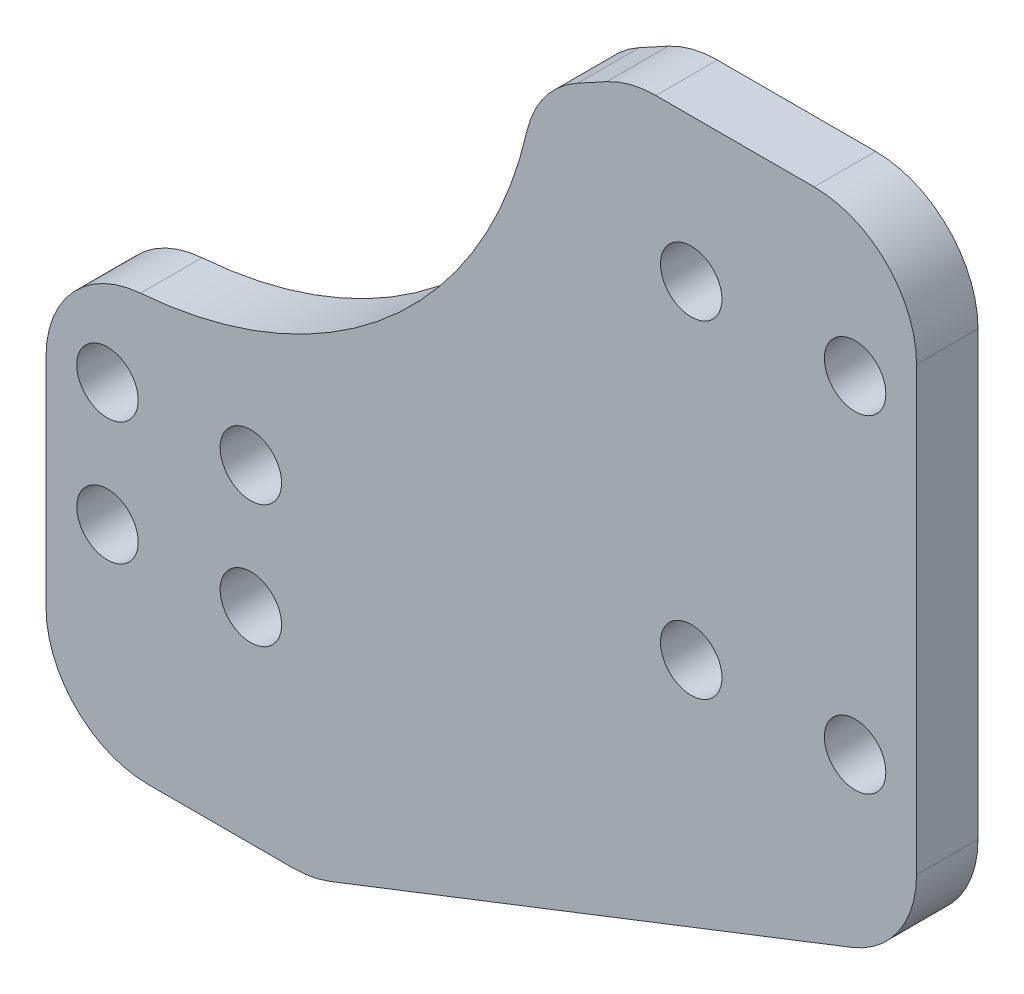
ISO-10303-21;
HEADER;
FILE_DESCRIPTION(('STEP AP214'),'2;1');
FILE_NAME('part.step','',(''),(''),'','','');
FILE_SCHEMA(('AUTOMOTIVE_DESIGN { 1 0 10303 214 1 1 1 1 }'));
ENDSEC;
DATA;
#1=APPLICATION_CONTEXT('core data for automotive mechanical design processes');
#2=APPLICATION_PROTOCOL_DEFINITION('international standard','automotive_design',2000,#1);
#3=PRODUCT_CONTEXT('',#1,'mechanical');
#4=PRODUCT('Part','Part','',(#3));
#5=PRODUCT_RELATED_PRODUCT_CATEGORY('part','',(#4));
#6=PRODUCT_DEFINITION_FORMATION('','',#4);
#7=PRODUCT_DEFINITION_CONTEXT('part definition',#1,'design');
#8=PRODUCT_DEFINITION('design','',#6,#7);
#9=PRODUCT_DEFINITION_SHAPE('','',#8);
#10=(LENGTH_UNIT() NAMED_UNIT(*) SI_UNIT(.MILLI.,.METRE.));
#11=(NAMED_UNIT(*) PLANE_ANGLE_UNIT() SI_UNIT($,.RADIAN.));
#12=(NAMED_UNIT(*) SI_UNIT($,.STERADIAN.) SOLID_ANGLE_UNIT());
#13=UNCERTAINTY_MEASURE_WITH_UNIT(LENGTH_MEASURE(1.E-05),#10,'distance_accuracy_value','');
#14=(GEOMETRIC_REPRESENTATION_CONTEXT(3) GLOBAL_UNCERTAINTY_ASSIGNED_CONTEXT((#13)) GLOBAL_UNIT_ASSIGNED_CONTEXT((#10,
#11,#12)) REPRESENTATION_CONTEXT('',''));
#15=CARTESIAN_POINT('',(0.,0.,0.));
#16=DIRECTION('',(0.,0.,1.));
#17=DIRECTION('',(1.,0.,0.));
#18=AXIS2_PLACEMENT_3D('',#15,#16,#17);
#19=CARTESIAN_POINT('',(0.,-13.,3.));
#20=DIRECTION('',(0.,1.,0.));
#21=DIRECTION('',(0.,0.,1.));
#22=AXIS2_PLACEMENT_3D('',#19,#20,#21);
#23=PLANE('',#22);
#24=DIRECTION('',(1.,0.,0.));
#25=VECTOR('',#24,1.);
#26=CARTESIAN_POINT('',(0.,-13.,3.));
#27=LINE('',#26,#25);
#28=CARTESIAN_POINT('',(-1.5,-13.,3.));
#29=VERTEX_POINT('',#28);
#30=CARTESIAN_POINT('',(5.55835501555251,-13.,3.));
#31=VERTEX_POINT('',#30);
#32=EDGE_CURVE('E168',#29,#31,#27,.T.);
#33=ORIENTED_EDGE('',*,*,#32,.F.);
#34=DIRECTION('',(0.,0.,-1.));
#35=VECTOR('',#34,1.);
#36=CARTESIAN_POINT('',(-1.5,-13.,0.));
#37=LINE('',#36,#35);
#38=CARTESIAN_POINT('',(-1.5,-13.,0.));
#39=VERTEX_POINT('',#38);
#40=EDGE_CURVE('E153',#29,#39,#37,.T.);
#41=ORIENTED_EDGE('',*,*,#40,.T.);
#42=DIRECTION('',(1.,0.,0.));
#43=VECTOR('',#42,1.);
#44=CARTESIAN_POINT('',(0.,-13.,0.));
#45=LINE('',#44,#43);
#46=CARTESIAN_POINT('',(5.55835501555251,-13.,0.));
#47=VERTEX_POINT('',#46);
#48=EDGE_CURVE('E165',#39,#47,#45,.T.);
#49=ORIENTED_EDGE('',*,*,#48,.T.);
#50=DIRECTION('',(0.,0.,-1.));
#51=VECTOR('',#50,1.);
#52=CARTESIAN_POINT('',(5.55835501555251,-13.,3.));
#53=LINE('',#52,#51);
#54=EDGE_CURVE('E170',#47,#31,#53,.F.);
#55=ORIENTED_EDGE('',*,*,#54,.T.);
#56=EDGE_LOOP('',(#33,#41,#49,#55));
#57=FACE_BOUND('',#56,.T.);
#58=ADVANCED_FACE('F46',(#57),#23,.F.);
#59=CARTESIAN_POINT('',(5.26495123835399,-13.4822970079377,3.));
#60=DIRECTION('',(0.363756352203741,-0.931494131077286,0.));
#61=DIRECTION('',(0.931494131077286,0.363756352203741,0.));
#62=AXIS2_PLACEMENT_3D('',#59,#60,#61);
#63=PLANE('',#62);
#64=DIRECTION('',(-0.931494131077286,-0.363756352203741,0.));
#65=VECTOR('',#64,1.);
#66=CARTESIAN_POINT('',(5.26495123835399,-13.4822970079377,3.));
#67=LINE('',#66,#65);
#68=CARTESIAN_POINT('',(32.8187817610187,-2.72229268179878,3.));
#69=VERTEX_POINT('',#68);
#70=CARTESIAN_POINT('',(7.37713677657121,-12.6574706553864,3.));
#71=VERTEX_POINT('',#70);
#72=EDGE_CURVE('E285',#69,#71,#67,.T.);
#73=ORIENTED_EDGE('',*,*,#72,.T.);
#74=DIRECTION('',(0.,0.,-1.));
#75=VECTOR('',#74,1.);
#76=CARTESIAN_POINT('',(7.37713677657121,-12.6574706553864,0.));
#77=LINE('',#76,#75);
#78=CARTESIAN_POINT('',(7.37713677657121,-12.6574706553864,0.));
#79=VERTEX_POINT('',#78);
#80=EDGE_CURVE('E236',#71,#79,#77,.T.);
#81=ORIENTED_EDGE('',*,*,#80,.T.);
#82=DIRECTION('',(-0.931494131077286,-0.363756352203741,0.));
#83=VECTOR('',#82,1.);
#84=CARTESIAN_POINT('',(5.26495123835399,-13.4822970079377,0.));
#85=LINE('',#84,#83);
#86=CARTESIAN_POINT('',(32.8187817610187,-2.72229268179878,0.));
#87=VERTEX_POINT('',#86);
#88=EDGE_CURVE('E175',#87,#79,#85,.T.);
#89=ORIENTED_EDGE('',*,*,#88,.F.);
#90=DIRECTION('',(0.,0.,-1.));
#91=VECTOR('',#90,1.);
#92=CARTESIAN_POINT('',(32.8187817610187,-2.72229268179877,3.));
#93=LINE('',#92,#91);
#94=EDGE_CURVE('E234',#87,#69,#93,.F.);
#95=ORIENTED_EDGE('',*,*,#94,.T.);
#96=EDGE_LOOP('',(#73,#81,#89,#95));
#97=FACE_BOUND('',#96,.T.);
#98=ADVANCED_FACE('F335',(#97),#63,.T.);
#99=CARTESIAN_POINT('',(36.,0.,3.));
#100=DIRECTION('',(1.,0.,0.));
#101=DIRECTION('',(0.,0.,-1.));
#102=AXIS2_PLACEMENT_3D('',#99,#100,#101);
#103=PLANE('',#102);
#104=DIRECTION('',(0.,-1.,0.));
#105=VECTOR('',#104,1.);
#106=CARTESIAN_POINT('',(36.,0.,3.));
#107=LINE('',#106,#105);
#108=CARTESIAN_POINT('',(36.,23.52,3.));
#109=VERTEX_POINT('',#108);
#110=CARTESIAN_POINT('',(36.,1.93517797358765,3.));
#111=VERTEX_POINT('',#110);
#112=EDGE_CURVE('E288',#109,#111,#107,.T.);
#113=ORIENTED_EDGE('',*,*,#112,.T.);
#114=DIRECTION('',(0.,0.,-1.));
#115=VECTOR('',#114,1.);
#116=CARTESIAN_POINT('',(36.,1.93517797358765,3.));
#117=LINE('',#116,#115);
#118=CARTESIAN_POINT('',(36.,1.93517797358765,0.));
#119=VERTEX_POINT('',#118);
#120=EDGE_CURVE('E241',#111,#119,#117,.T.);
#121=ORIENTED_EDGE('',*,*,#120,.T.);
#122=DIRECTION('',(0.,-1.,0.));
#123=VECTOR('',#122,1.);
#124=CARTESIAN_POINT('',(36.,0.,0.));
#125=LINE('',#124,#123);
#126=CARTESIAN_POINT('',(36.,23.52,0.));
#127=VERTEX_POINT('',#126);
#128=EDGE_CURVE('E178',#127,#119,#125,.T.);
#129=ORIENTED_EDGE('',*,*,#128,.F.);
#130=DIRECTION('',(0.,0.,-1.));
#131=VECTOR('',#130,1.);
#132=CARTESIAN_POINT('',(36.,23.52,3.));
#133=LINE('',#132,#131);
#134=EDGE_CURVE('E239',#127,#109,#133,.F.);
#135=ORIENTED_EDGE('',*,*,#134,.T.);
#136=EDGE_LOOP('',(#113,#121,#129,#135));
#137=FACE_BOUND('',#136,.T.);
#138=ADVANCED_FACE('F340',(#137),#103,.T.);
#139=CARTESIAN_POINT('',(0.,28.52,3.));
#140=DIRECTION('',(0.,1.,0.));
#141=DIRECTION('',(0.,0.,1.));
#142=AXIS2_PLACEMENT_3D('',#139,#140,#141);
#143=PLANE('',#142);
#144=DIRECTION('',(1.,0.,0.));
#145=VECTOR('',#144,1.);
#146=CARTESIAN_POINT('',(0.,28.52,3.));
#147=LINE('',#146,#145);
#148=CARTESIAN_POINT('',(23.2731367880601,28.52,3.));
#149=VERTEX_POINT('',#148);
#150=CARTESIAN_POINT('',(31.,28.52,3.));
#151=VERTEX_POINT('',#150);
#152=EDGE_CURVE('E291',#149,#151,#147,.T.);
#153=ORIENTED_EDGE('',*,*,#152,.T.);
#154=DIRECTION('',(0.,0.,-1.));
#155=VECTOR('',#154,1.);
#156=CARTESIAN_POINT('',(31.,28.52,3.));
#157=LINE('',#156,#155);
#158=CARTESIAN_POINT('',(31.,28.52,0.));
#159=VERTEX_POINT('',#158);
#160=EDGE_CURVE('E246',#151,#159,#157,.T.);
#161=ORIENTED_EDGE('',*,*,#160,.T.);
#162=DIRECTION('',(1.,0.,0.));
#163=VECTOR('',#162,1.);
#164=CARTESIAN_POINT('',(0.,28.52,0.));
#165=LINE('',#164,#163);
#166=CARTESIAN_POINT('',(23.2731367880601,28.52,0.));
#167=VERTEX_POINT('',#166);
#168=EDGE_CURVE('E187',#167,#159,#165,.T.);
#169=ORIENTED_EDGE('',*,*,#168,.F.);
#170=DIRECTION('',(0.,0.,-1.));
#171=VECTOR('',#170,1.);
#172=CARTESIAN_POINT('',(23.2731367880601,28.52,3.));
#173=LINE('',#172,#171);
#174=EDGE_CURVE('E244',#167,#149,#173,.F.);
#175=ORIENTED_EDGE('',*,*,#174,.T.);
#176=EDGE_LOOP('',(#153,#161,#169,#175));
#177=FACE_BOUND('',#176,.T.);
#178=ADVANCED_FACE('F346',(#177),#143,.T.);
#179=CARTESIAN_POINT('',(-6.94680076466091,12.7566895485075,3.));
#180=DIRECTION('',(0.478247495233169,-0.878225104004207,0.));
#181=DIRECTION('',(0.878225104004207,0.478247495233169,0.));
#182=AXIS2_PLACEMENT_3D('',#179,#180,#181);
#183=PLANE('',#182);
#184=DIRECTION('',(-0.878225104004207,-0.478247495233169,0.));
#185=VECTOR('',#184,1.);
#186=CARTESIAN_POINT('',(-6.94680076466091,12.7566895485075,3.));
#187=LINE('',#186,#185);
#188=CARTESIAN_POINT('',(20.8818993118943,27.9111255200211,3.));
#189=VERTEX_POINT('',#188);
#190=CARTESIAN_POINT('',(19.4593714707317,27.1364717623073,3.));
#191=VERTEX_POINT('',#190);
#192=EDGE_CURVE('E294',#189,#191,#187,.T.);
#193=ORIENTED_EDGE('',*,*,#192,.F.);
#194=DIRECTION('',(0.,0.,-1.));
#195=VECTOR('',#194,1.);
#196=CARTESIAN_POINT('',(20.8818993118943,27.9111255200211,0.));
#197=LINE('',#196,#195);
#198=CARTESIAN_POINT('',(20.8818993118943,27.9111255200211,0.));
#199=VERTEX_POINT('',#198);
#200=EDGE_CURVE('E251',#189,#199,#197,.T.);
#201=ORIENTED_EDGE('',*,*,#200,.T.);
#202=DIRECTION('',(-0.878225104004207,-0.478247495233169,0.));
#203=VECTOR('',#202,1.);
#204=CARTESIAN_POINT('',(-6.94680076466091,12.7566895485075,0.));
#205=LINE('',#204,#203);
#206=CARTESIAN_POINT('',(19.4593714707317,27.1364717623073,0.));
#207=VERTEX_POINT('',#206);
#208=EDGE_CURVE('E190',#199,#207,#205,.T.);
#209=ORIENTED_EDGE('',*,*,#208,.T.);
#210=DIRECTION('',(0.,0.,1.));
#211=VECTOR('',#210,1.);
#212=CARTESIAN_POINT('',(19.4593714707317,27.1364717623072,3.));
#213=LINE('',#212,#211);
#214=EDGE_CURVE('E249',#207,#191,#213,.T.);
#215=ORIENTED_EDGE('',*,*,#214,.T.);
#216=EDGE_LOOP('',(#193,#201,#209,#215));
#217=FACE_BOUND('',#216,.T.);
#218=ADVANCED_FACE('F350',(#217),#183,.F.);
#219=CARTESIAN_POINT('',(33.,5.52,3.));
#220=DIRECTION('',(0.,0.,-1.));
#221=DIRECTION('',(-1.,0.,0.));
#222=AXIS2_PLACEMENT_3D('',#219,#220,#221);
#223=CYLINDRICAL_SURFACE('',#222,1.5);
#224=CARTESIAN_POINT('',(33.,5.52,3.));
#225=DIRECTION('',(0.,0.,1.));
#226=DIRECTION('',(1.,0.,0.));
#227=AXIS2_PLACEMENT_3D('',#224,#225,#226);
#228=CIRCLE('',#227,1.5);
#229=CARTESIAN_POINT('',(34.5,5.52,3.));
#230=VERTEX_POINT('',#229);
#231=EDGE_CURVE('E304',#230,#230,#228,.T.);
#232=ORIENTED_EDGE('',*,*,#231,.T.);
#233=EDGE_LOOP('',(#232));
#234=FACE_BOUND('',#233,.T.);
#235=CARTESIAN_POINT('',(33.,5.52,0.));
#236=DIRECTION('',(0.,0.,1.));
#237=DIRECTION('',(1.,0.,0.));
#238=AXIS2_PLACEMENT_3D('',#235,#236,#237);
#239=CIRCLE('',#238,1.5);
#240=CARTESIAN_POINT('',(34.5,5.52,0.));
#241=VERTEX_POINT('',#240);
#242=EDGE_CURVE('E201',#241,#241,#239,.T.);
#243=ORIENTED_EDGE('',*,*,#242,.F.);
#244=EDGE_LOOP('',(#243));
#245=FACE_BOUND('',#244,.T.);
#246=ADVANCED_FACE('F354',(#234,#245),#223,.F.);
#247=CARTESIAN_POINT('',(25.,5.52,3.));
#248=DIRECTION('',(0.,0.,-1.));
#249=DIRECTION('',(-1.,0.,0.));
#250=AXIS2_PLACEMENT_3D('',#247,#248,#249);
#251=CYLINDRICAL_SURFACE('',#250,1.5);
#252=CARTESIAN_POINT('',(25.,5.52,3.));
#253=DIRECTION('',(0.,0.,1.));
#254=DIRECTION('',(1.,0.,0.));
#255=AXIS2_PLACEMENT_3D('',#252,#253,#254);
#256=CIRCLE('',#255,1.5);
#257=CARTESIAN_POINT('',(26.5,5.52,3.));
#258=VERTEX_POINT('',#257);
#259=EDGE_CURVE('E301',#258,#258,#256,.T.);
#260=ORIENTED_EDGE('',*,*,#259,.T.);
#261=EDGE_LOOP('',(#260));
#262=FACE_BOUND('',#261,.T.);
#263=CARTESIAN_POINT('',(25.,5.52,0.));
#264=DIRECTION('',(0.,0.,1.));
#265=DIRECTION('',(1.,0.,0.));
#266=AXIS2_PLACEMENT_3D('',#263,#264,#265);
#267=CIRCLE('',#266,1.5);
#268=CARTESIAN_POINT('',(26.5,5.52,0.));
#269=VERTEX_POINT('',#268);
#270=EDGE_CURVE('E198',#269,#269,#267,.T.);
#271=ORIENTED_EDGE('',*,*,#270,.F.);
#272=EDGE_LOOP('',(#271));
#273=FACE_BOUND('',#272,.T.);
#274=ADVANCED_FACE('F362',(#262,#273),#251,.F.);
#275=CARTESIAN_POINT('',(25.,21.52,3.));
#276=DIRECTION('',(0.,0.,-1.));
#277=DIRECTION('',(-1.,0.,0.));
#278=AXIS2_PLACEMENT_3D('',#275,#276,#277);
#279=CYLINDRICAL_SURFACE('',#278,1.5);
#280=CARTESIAN_POINT('',(25.,21.52,3.));
#281=DIRECTION('',(0.,0.,1.));
#282=DIRECTION('',(1.,0.,0.));
#283=AXIS2_PLACEMENT_3D('',#280,#281,#282);
#284=CIRCLE('',#283,1.5);
#285=CARTESIAN_POINT('',(26.5,21.52,3.));
#286=VERTEX_POINT('',#285);
#287=EDGE_CURVE('E298',#286,#286,#284,.T.);
#288=ORIENTED_EDGE('',*,*,#287,.T.);
#289=EDGE_LOOP('',(#288));
#290=FACE_BOUND('',#289,.T.);
#291=CARTESIAN_POINT('',(25.,21.52,0.));
#292=DIRECTION('',(0.,0.,1.));
#293=DIRECTION('',(1.,0.,0.));
#294=AXIS2_PLACEMENT_3D('',#291,#292,#293);
#295=CIRCLE('',#294,1.5);
#296=CARTESIAN_POINT('',(26.5,21.52,0.));
#297=VERTEX_POINT('',#296);
#298=EDGE_CURVE('E195',#297,#297,#295,.T.);
#299=ORIENTED_EDGE('',*,*,#298,.F.);
#300=EDGE_LOOP('',(#299));
#301=FACE_BOUND('',#300,.T.);
#302=ADVANCED_FACE('F358',(#290,#301),#279,.F.);
#303=CARTESIAN_POINT('',(-6.5,0.,3.));
#304=DIRECTION('',(-1.,0.,0.));
#305=DIRECTION('',(0.,0.,1.));
#306=AXIS2_PLACEMENT_3D('',#303,#304,#305);
#307=PLANE('',#306);
#308=DIRECTION('',(0.,1.,0.));
#309=VECTOR('',#308,1.);
#310=CARTESIAN_POINT('',(-6.5,0.,0.));
#311=LINE('',#310,#309);
#312=CARTESIAN_POINT('',(-6.5,-8.,0.));
#313=VERTEX_POINT('',#312);
#314=CARTESIAN_POINT('',(-6.5,2.59703720636856,0.));
#315=VERTEX_POINT('',#314);
#316=EDGE_CURVE('E193',#313,#315,#311,.T.);
#317=ORIENTED_EDGE('',*,*,#316,.F.);
#318=DIRECTION('',(0.,0.,-1.));
#319=VECTOR('',#318,1.);
#320=CARTESIAN_POINT('',(-6.5,-8.,3.));
#321=LINE('',#320,#319);
#322=CARTESIAN_POINT('',(-6.5,-8.,3.));
#323=VERTEX_POINT('',#322);
#324=EDGE_CURVE('E154',#313,#323,#321,.F.);
#325=ORIENTED_EDGE('',*,*,#324,.T.);
#326=DIRECTION('',(0.,1.,0.));
#327=VECTOR('',#326,1.);
#328=CARTESIAN_POINT('',(-6.5,0.,3.));
#329=LINE('',#328,#327);
#330=CARTESIAN_POINT('',(-6.5,2.59703720636856,3.));
#331=VERTEX_POINT('',#330);
#332=EDGE_CURVE('E296',#323,#331,#329,.T.);
#333=ORIENTED_EDGE('',*,*,#332,.T.);
#334=DIRECTION('',(0.,0.,-1.));
#335=VECTOR('',#334,1.);
#336=CARTESIAN_POINT('',(-6.5,2.59703720636856,0.));
#337=LINE('',#336,#335);
#338=EDGE_CURVE('E159',#331,#315,#337,.T.);
#339=ORIENTED_EDGE('',*,*,#338,.T.);
#340=EDGE_LOOP('',(#317,#325,#333,#339));
#341=FACE_BOUND('',#340,.T.);
#342=ADVANCED_FACE('F331',(#341),#307,.T.);
#343=CARTESIAN_POINT('',(3.5,3.,3.));
#344=DIRECTION('',(0.,0.,-1.));
#345=DIRECTION('',(-1.,0.,0.));
#346=AXIS2_PLACEMENT_3D('',#343,#344,#345);
#347=CYLINDRICAL_SURFACE('',#346,1.5);
#348=CARTESIAN_POINT('',(3.5,3.,3.));
#349=DIRECTION('',(0.,0.,1.));
#350=DIRECTION('',(1.,0.,0.));
#351=AXIS2_PLACEMENT_3D('',#348,#349,#350);
#352=CIRCLE('',#351,1.5);
#353=CARTESIAN_POINT('',(5.,3.,3.));
#354=VERTEX_POINT('',#353);
#355=EDGE_CURVE('E281',#354,#354,#352,.T.);
#356=ORIENTED_EDGE('',*,*,#355,.T.);
#357=EDGE_LOOP('',(#356));
#358=FACE_BOUND('',#357,.T.);
#359=CARTESIAN_POINT('',(3.5,3.,0.));
#360=DIRECTION('',(0.,0.,1.));
#361=DIRECTION('',(1.,0.,0.));
#362=AXIS2_PLACEMENT_3D('',#359,#360,#361);
#363=CIRCLE('',#362,1.5);
#364=CARTESIAN_POINT('',(5.,3.,0.));
#365=VERTEX_POINT('',#364);
#366=EDGE_CURVE('E176',#365,#365,#363,.T.);
#367=ORIENTED_EDGE('',*,*,#366,.F.);
#368=EDGE_LOOP('',(#367));
#369=FACE_BOUND('',#368,.T.);
#370=ADVANCED_FACE('F321',(#358,#369),#347,.F.);
#371=CARTESIAN_POINT('',(3.5,-3.,3.));
#372=DIRECTION('',(0.,0.,-1.));
#373=DIRECTION('',(-1.,0.,0.));
#374=AXIS2_PLACEMENT_3D('',#371,#372,#373);
#375=CYLINDRICAL_SURFACE('',#374,1.5);
#376=CARTESIAN_POINT('',(3.5,-3.,3.));
#377=DIRECTION('',(0.,0.,1.));
#378=DIRECTION('',(1.,0.,0.));
#379=AXIS2_PLACEMENT_3D('',#376,#377,#378);
#380=CIRCLE('',#379,1.5);
#381=CARTESIAN_POINT('',(5.,-3.,3.));
#382=VERTEX_POINT('',#381);
#383=EDGE_CURVE('E278',#382,#382,#380,.T.);
#384=ORIENTED_EDGE('',*,*,#383,.T.);
#385=EDGE_LOOP('',(#384));
#386=FACE_BOUND('',#385,.T.);
#387=CARTESIAN_POINT('',(3.5,-3.,0.));
#388=DIRECTION('',(0.,0.,1.));
#389=DIRECTION('',(1.,0.,0.));
#390=AXIS2_PLACEMENT_3D('',#387,#388,#389);
#391=CIRCLE('',#390,1.5);
#392=CARTESIAN_POINT('',(5.,-3.,0.));
#393=VERTEX_POINT('',#392);
#394=EDGE_CURVE('E181',#393,#393,#391,.T.);
#395=ORIENTED_EDGE('',*,*,#394,.F.);
#396=EDGE_LOOP('',(#395));
#397=FACE_BOUND('',#396,.T.);
#398=ADVANCED_FACE('F318',(#386,#397),#375,.F.);
#399=CARTESIAN_POINT('',(-3.5,-3.,3.));
#400=DIRECTION('',(0.,0.,-1.));
#401=DIRECTION('',(-1.,0.,0.));
#402=AXIS2_PLACEMENT_3D('',#399,#400,#401);
#403=CYLINDRICAL_SURFACE('',#402,1.5);
#404=CARTESIAN_POINT('',(-3.5,-3.,3.));
#405=DIRECTION('',(0.,0.,1.));
#406=DIRECTION('',(1.,0.,0.));
#407=AXIS2_PLACEMENT_3D('',#404,#405,#406);
#408=CIRCLE('',#407,1.5);
#409=CARTESIAN_POINT('',(-2.,-3.,3.));
#410=VERTEX_POINT('',#409);
#411=EDGE_CURVE('E275',#410,#410,#408,.T.);
#412=ORIENTED_EDGE('',*,*,#411,.T.);
#413=EDGE_LOOP('',(#412));
#414=FACE_BOUND('',#413,.T.);
#415=CARTESIAN_POINT('',(-3.5,-3.,0.));
#416=DIRECTION('',(0.,0.,1.));
#417=DIRECTION('',(1.,0.,0.));
#418=AXIS2_PLACEMENT_3D('',#415,#416,#417);
#419=CIRCLE('',#418,1.5);
#420=CARTESIAN_POINT('',(-2.,-3.,0.));
#421=VERTEX_POINT('',#420);
#422=EDGE_CURVE('E311',#421,#421,#419,.T.);
#423=ORIENTED_EDGE('',*,*,#422,.F.);
#424=EDGE_LOOP('',(#423));
#425=FACE_BOUND('',#424,.T.);
#426=ADVANCED_FACE('F320',(#414,#425),#403,.F.);
#427=CARTESIAN_POINT('',(-3.5,3.,3.));
#428=DIRECTION('',(0.,0.,-1.));
#429=DIRECTION('',(-1.,0.,0.));
#430=AXIS2_PLACEMENT_3D('',#427,#428,#429);
#431=CYLINDRICAL_SURFACE('',#430,1.5);
#432=CARTESIAN_POINT('',(-3.5,3.,3.));
#433=DIRECTION('',(0.,0.,1.));
#434=DIRECTION('',(1.,0.,0.));
#435=AXIS2_PLACEMENT_3D('',#432,#433,#434);
#436=CIRCLE('',#435,1.5);
#437=CARTESIAN_POINT('',(-2.,3.,3.));
#438=VERTEX_POINT('',#437);
#439=EDGE_CURVE('E207',#438,#438,#436,.T.);
#440=ORIENTED_EDGE('',*,*,#439,.T.);
#441=EDGE_LOOP('',(#440));
#442=FACE_BOUND('',#441,.T.);
#443=CARTESIAN_POINT('',(-3.5,3.,0.));
#444=DIRECTION('',(0.,0.,1.));
#445=DIRECTION('',(1.,0.,0.));
#446=AXIS2_PLACEMENT_3D('',#443,#444,#445);
#447=CIRCLE('',#446,1.5);
#448=CARTESIAN_POINT('',(-2.,3.,0.));
#449=VERTEX_POINT('',#448);
#450=EDGE_CURVE('E270',#449,#449,#447,.T.);
#451=ORIENTED_EDGE('',*,*,#450,.F.);
#452=EDGE_LOOP('',(#451));
#453=FACE_BOUND('',#452,.T.);
#454=ADVANCED_FACE('F328',(#442,#453),#431,.F.);
#455=CARTESIAN_POINT('',(33.,21.52,3.));
#456=DIRECTION('',(0.,0.,-1.));
#457=DIRECTION('',(-1.,0.,0.));
#458=AXIS2_PLACEMENT_3D('',#455,#456,#457);
#459=CYLINDRICAL_SURFACE('',#458,1.5);
#460=CARTESIAN_POINT('',(33.,21.52,3.));
#461=DIRECTION('',(0.,0.,1.));
#462=DIRECTION('',(1.,0.,0.));
#463=AXIS2_PLACEMENT_3D('',#460,#461,#462);
#464=CIRCLE('',#463,1.5);
#465=CARTESIAN_POINT('',(34.5,21.52,3.));
#466=VERTEX_POINT('',#465);
#467=EDGE_CURVE('E208',#466,#466,#464,.T.);
#468=ORIENTED_EDGE('',*,*,#467,.T.);
#469=EDGE_LOOP('',(#468));
#470=FACE_BOUND('',#469,.T.);
#471=CARTESIAN_POINT('',(33.,21.52,0.));
#472=DIRECTION('',(0.,0.,1.));
#473=DIRECTION('',(1.,0.,0.));
#474=AXIS2_PLACEMENT_3D('',#471,#472,#473);
#475=CIRCLE('',#474,1.5);
#476=CARTESIAN_POINT('',(34.5,21.52,0.));
#477=VERTEX_POINT('',#476);
#478=EDGE_CURVE('E204',#477,#477,#475,.T.);
#479=ORIENTED_EDGE('',*,*,#478,.F.);
#480=EDGE_LOOP('',(#479));
#481=FACE_BOUND('',#480,.T.);
#482=ADVANCED_FACE('F370',(#470,#481),#459,.F.);
#483=CARTESIAN_POINT('',(0.,0.,3.));
#484=DIRECTION('',(0.,0.,1.));
#485=DIRECTION('',(1.,0.,0.));
#486=AXIS2_PLACEMENT_3D('',#483,#484,#485);
#487=PLANE('',#486);
#488=ORIENTED_EDGE('',*,*,#332,.F.);
#489=CARTESIAN_POINT('',(-1.5,-8.,3.));
#490=DIRECTION('',(0.,0.,1.));
#491=DIRECTION('',(1.,0.,0.));
#492=AXIS2_PLACEMENT_3D('',#489,#490,#491);
#493=CIRCLE('',#492,5.);
#494=EDGE_CURVE('E232',#323,#29,#493,.T.);
#495=ORIENTED_EDGE('',*,*,#494,.T.);
#496=ORIENTED_EDGE('',*,*,#32,.T.);
#497=CARTESIAN_POINT('',(5.55835501555251,-8.,3.));
#498=DIRECTION('',(0.,0.,1.));
#499=DIRECTION('',(1.,0.,0.));
#500=AXIS2_PLACEMENT_3D('',#497,#498,#499);
#501=CIRCLE('',#500,5.);
#502=EDGE_CURVE('E230',#31,#71,#501,.T.);
#503=ORIENTED_EDGE('',*,*,#502,.T.);
#504=ORIENTED_EDGE('',*,*,#72,.F.);
#505=CARTESIAN_POINT('',(31.,1.93517797358765,3.));
#506=DIRECTION('',(0.,0.,1.));
#507=DIRECTION('',(1.,0.,0.));
#508=AXIS2_PLACEMENT_3D('',#505,#506,#507);
#509=CIRCLE('',#508,5.);
#510=EDGE_CURVE('E228',#69,#111,#509,.T.);
#511=ORIENTED_EDGE('',*,*,#510,.T.);
#512=ORIENTED_EDGE('',*,*,#112,.F.);
#513=CARTESIAN_POINT('',(31.,23.52,3.));
#514=DIRECTION('',(0.,0.,1.));
#515=DIRECTION('',(1.,0.,0.));
#516=AXIS2_PLACEMENT_3D('',#513,#514,#515);
#517=CIRCLE('',#516,5.);
#518=EDGE_CURVE('E226',#109,#151,#517,.T.);
#519=ORIENTED_EDGE('',*,*,#518,.T.);
#520=ORIENTED_EDGE('',*,*,#152,.F.);
#521=CARTESIAN_POINT('',(23.2731367880601,23.52,3.));
#522=DIRECTION('',(0.,0.,1.));
#523=DIRECTION('',(1.,0.,0.));
#524=AXIS2_PLACEMENT_3D('',#521,#522,#523);
#525=CIRCLE('',#524,5.);
#526=EDGE_CURVE('E69',#149,#189,#525,.T.);
#527=ORIENTED_EDGE('',*,*,#526,.T.);
#528=ORIENTED_EDGE('',*,*,#192,.T.);
#529=CARTESIAN_POINT('',(21.8506089468975,22.7453462422862,3.));
#530=DIRECTION('',(0.,0.,1.));
#531=DIRECTION('',(1.,0.,0.));
#532=AXIS2_PLACEMENT_3D('',#529,#530,#531);
#533=CIRCLE('',#532,5.);
#534=CARTESIAN_POINT('',(16.9754918417249,23.8558565803081,3.));
#535=VERTEX_POINT('',#534);
#536=EDGE_CURVE('E61',#191,#535,#533,.T.);
#537=ORIENTED_EDGE('',*,*,#536,.T.);
#538=CARTESIAN_POINT('',(-3.5,28.52,3.));
#539=DIRECTION('',(0.,0.,1.));
#540=DIRECTION('',(1.,0.,0.));
#541=AXIS2_PLACEMENT_3D('',#538,#539,#540);
#542=CIRCLE('',#541,21.);
#543=CARTESIAN_POINT('',(-1.88461538461539,7.58222235898999,3.));
#544=VERTEX_POINT('',#543);
#545=EDGE_CURVE('E260',#544,#535,#542,.T.);
#546=ORIENTED_EDGE('',*,*,#545,.F.);
#547=CARTESIAN_POINT('',(-1.5,2.59703720636856,3.));
#548=DIRECTION('',(0.,0.,1.));
#549=DIRECTION('',(1.,0.,0.));
#550=AXIS2_PLACEMENT_3D('',#547,#548,#549);
#551=CIRCLE('',#550,5.);
#552=EDGE_CURVE('E222',#544,#331,#551,.T.);
#553=ORIENTED_EDGE('',*,*,#552,.T.);
#554=EDGE_LOOP('',(#488,#495,#496,#503,#504,#511,#512,#519,#520,#527,#528,#537,#546,#553));
#555=FACE_BOUND('',#554,.T.);
#556=ORIENTED_EDGE('',*,*,#439,.F.);
#557=EDGE_LOOP('',(#556));
#558=FACE_BOUND('',#557,.T.);
#559=ORIENTED_EDGE('',*,*,#411,.F.);
#560=EDGE_LOOP('',(#559));
#561=FACE_BOUND('',#560,.T.);
#562=ORIENTED_EDGE('',*,*,#383,.F.);
#563=EDGE_LOOP('',(#562));
#564=FACE_BOUND('',#563,.T.);
#565=ORIENTED_EDGE('',*,*,#355,.F.);
#566=EDGE_LOOP('',(#565));
#567=FACE_BOUND('',#566,.T.);
#568=ORIENTED_EDGE('',*,*,#287,.F.);
#569=EDGE_LOOP('',(#568));
#570=FACE_BOUND('',#569,.T.);
#571=ORIENTED_EDGE('',*,*,#259,.F.);
#572=EDGE_LOOP('',(#571));
#573=FACE_BOUND('',#572,.T.);
#574=ORIENTED_EDGE('',*,*,#231,.F.);
#575=EDGE_LOOP('',(#574));
#576=FACE_BOUND('',#575,.T.);
#577=ORIENTED_EDGE('',*,*,#467,.F.);
#578=EDGE_LOOP('',(#577));
#579=FACE_BOUND('',#578,.T.);
#580=ADVANCED_FACE('F266',(#555,#558,#561,#564,#567,#570,#573,#576,#579),#487,.T.);
#581=CARTESIAN_POINT('',(0.,0.,0.));
#582=DIRECTION('',(0.,0.,1.));
#583=DIRECTION('',(1.,0.,0.));
#584=AXIS2_PLACEMENT_3D('',#581,#582,#583);
#585=PLANE('',#584);
#586=ORIENTED_EDGE('',*,*,#450,.T.);
#587=EDGE_LOOP('',(#586));
#588=FACE_BOUND('',#587,.T.);
#589=ORIENTED_EDGE('',*,*,#422,.T.);
#590=EDGE_LOOP('',(#589));
#591=FACE_BOUND('',#590,.T.);
#592=ORIENTED_EDGE('',*,*,#394,.T.);
#593=EDGE_LOOP('',(#592));
#594=FACE_BOUND('',#593,.T.);
#595=ORIENTED_EDGE('',*,*,#366,.T.);
#596=EDGE_LOOP('',(#595));
#597=FACE_BOUND('',#596,.T.);
#598=ORIENTED_EDGE('',*,*,#48,.F.);
#599=CARTESIAN_POINT('',(-1.5,-8.,0.));
#600=DIRECTION('',(0.,0.,1.));
#601=DIRECTION('',(1.,0.,0.));
#602=AXIS2_PLACEMENT_3D('',#599,#600,#601);
#603=CIRCLE('',#602,5.);
#604=EDGE_CURVE('E149',#39,#313,#603,.F.);
#605=ORIENTED_EDGE('',*,*,#604,.T.);
#606=ORIENTED_EDGE('',*,*,#316,.T.);
#607=CARTESIAN_POINT('',(-1.5,2.59703720636856,0.));
#608=DIRECTION('',(0.,0.,1.));
#609=DIRECTION('',(1.,0.,0.));
#610=AXIS2_PLACEMENT_3D('',#607,#608,#609);
#611=CIRCLE('',#610,5.);
#612=CARTESIAN_POINT('',(-1.88461538461539,7.58222235898999,0.));
#613=VERTEX_POINT('',#612);
#614=EDGE_CURVE('E169',#315,#613,#611,.F.);
#615=ORIENTED_EDGE('',*,*,#614,.T.);
#616=CARTESIAN_POINT('',(-3.5,28.52,0.));
#617=DIRECTION('',(0.,0.,1.));
#618=DIRECTION('',(1.,0.,0.));
#619=AXIS2_PLACEMENT_3D('',#616,#617,#618);
#620=CIRCLE('',#619,21.);
#621=CARTESIAN_POINT('',(16.9754918417249,23.8558565803081,0.));
#622=VERTEX_POINT('',#621);
#623=EDGE_CURVE('E262',#613,#622,#620,.T.);
#624=ORIENTED_EDGE('',*,*,#623,.T.);
#625=CARTESIAN_POINT('',(21.8506089468975,22.7453462422862,0.));
#626=DIRECTION('',(0.,0.,1.));
#627=DIRECTION('',(1.,0.,0.));
#628=AXIS2_PLACEMENT_3D('',#625,#626,#627);
#629=CIRCLE('',#628,5.);
#630=EDGE_CURVE('E211',#622,#207,#629,.F.);
#631=ORIENTED_EDGE('',*,*,#630,.T.);
#632=ORIENTED_EDGE('',*,*,#208,.F.);
#633=CARTESIAN_POINT('',(23.2731367880601,23.52,0.));
#634=DIRECTION('',(0.,0.,1.));
#635=DIRECTION('',(1.,0.,0.));
#636=AXIS2_PLACEMENT_3D('',#633,#634,#635);
#637=CIRCLE('',#636,5.);
#638=EDGE_CURVE('E213',#199,#167,#637,.F.);
#639=ORIENTED_EDGE('',*,*,#638,.T.);
#640=ORIENTED_EDGE('',*,*,#168,.T.);
#641=CARTESIAN_POINT('',(31.,23.52,0.));
#642=DIRECTION('',(0.,0.,1.));
#643=DIRECTION('',(1.,0.,0.));
#644=AXIS2_PLACEMENT_3D('',#641,#642,#643);
#645=CIRCLE('',#644,5.);
#646=EDGE_CURVE('E215',#159,#127,#645,.F.);
#647=ORIENTED_EDGE('',*,*,#646,.T.);
#648=ORIENTED_EDGE('',*,*,#128,.T.);
#649=CARTESIAN_POINT('',(31.,1.93517797358765,0.));
#650=DIRECTION('',(0.,0.,1.));
#651=DIRECTION('',(1.,0.,0.));
#652=AXIS2_PLACEMENT_3D('',#649,#650,#651);
#653=CIRCLE('',#652,5.);
#654=EDGE_CURVE('E217',#119,#87,#653,.F.);
#655=ORIENTED_EDGE('',*,*,#654,.T.);
#656=ORIENTED_EDGE('',*,*,#88,.T.);
#657=CARTESIAN_POINT('',(5.55835501555251,-8.,0.));
#658=DIRECTION('',(0.,0.,1.));
#659=DIRECTION('',(1.,0.,0.));
#660=AXIS2_PLACEMENT_3D('',#657,#658,#659);
#661=CIRCLE('',#660,5.);
#662=EDGE_CURVE('E160',#79,#47,#661,.F.);
#663=ORIENTED_EDGE('',*,*,#662,.T.);
#664=EDGE_LOOP('',(#598,#605,#606,#615,#624,#631,#632,#639,#640,#647,#648,#655,#656,#663));
#665=FACE_BOUND('',#664,.T.);
#666=ORIENTED_EDGE('',*,*,#298,.T.);
#667=EDGE_LOOP('',(#666));
#668=FACE_BOUND('',#667,.T.);
#669=ORIENTED_EDGE('',*,*,#270,.T.);
#670=EDGE_LOOP('',(#669));
#671=FACE_BOUND('',#670,.T.);
#672=ORIENTED_EDGE('',*,*,#242,.T.);
#673=EDGE_LOOP('',(#672));
#674=FACE_BOUND('',#673,.T.);
#675=ORIENTED_EDGE('',*,*,#478,.T.);
#676=EDGE_LOOP('',(#675));
#677=FACE_BOUND('',#676,.T.);
#678=ADVANCED_FACE('F172',(#588,#591,#594,#597,#665,#668,#671,#674,#677),#585,.F.);
#679=CARTESIAN_POINT('',(-3.5,28.52,0.));
#680=DIRECTION('',(0.,0.,1.));
#681=DIRECTION('',(1.,0.,0.));
#682=AXIS2_PLACEMENT_3D('',#679,#680,#681);
#683=CYLINDRICAL_SURFACE('',#682,21.);
#684=ORIENTED_EDGE('',*,*,#545,.T.);
#685=DIRECTION('',(0.,0.,1.));
#686=VECTOR('',#685,1.);
#687=CARTESIAN_POINT('',(16.9754918417249,23.8558565803081,0.));
#688=LINE('',#687,#686);
#689=EDGE_CURVE('E11',#535,#622,#688,.F.);
#690=ORIENTED_EDGE('',*,*,#689,.T.);
#691=ORIENTED_EDGE('',*,*,#623,.F.);
#692=DIRECTION('',(0.,0.,1.));
#693=VECTOR('',#692,1.);
#694=CARTESIAN_POINT('',(-1.88461538461539,7.58222235898999,0.));
#695=LINE('',#694,#693);
#696=EDGE_CURVE('E54',#613,#544,#695,.T.);
#697=ORIENTED_EDGE('',*,*,#696,.T.);
#698=EDGE_LOOP('',(#684,#690,#691,#697));
#699=FACE_BOUND('',#698,.T.);
#700=ADVANCED_FACE('F259',(#699),#683,.F.);
#701=CARTESIAN_POINT('',(-1.5,-8.,3.));
#702=DIRECTION('',(0.,0.,1.));
#703=DIRECTION('',(1.,0.,0.));
#704=AXIS2_PLACEMENT_3D('',#701,#702,#703);
#705=CYLINDRICAL_SURFACE('',#704,5.);
#706=ORIENTED_EDGE('',*,*,#494,.F.);
#707=ORIENTED_EDGE('',*,*,#324,.F.);
#708=ORIENTED_EDGE('',*,*,#604,.F.);
#709=ORIENTED_EDGE('',*,*,#40,.F.);
#710=EDGE_LOOP('',(#706,#707,#708,#709));
#711=FACE_BOUND('',#710,.T.);
#712=ADVANCED_FACE('F152',(#711),#705,.T.);
#713=CARTESIAN_POINT('',(5.55835501555251,-8.,3.));
#714=DIRECTION('',(0.,0.,1.));
#715=DIRECTION('',(1.,0.,0.));
#716=AXIS2_PLACEMENT_3D('',#713,#714,#715);
#717=CYLINDRICAL_SURFACE('',#716,5.);
#718=ORIENTED_EDGE('',*,*,#502,.F.);
#719=ORIENTED_EDGE('',*,*,#54,.F.);
#720=ORIENTED_EDGE('',*,*,#662,.F.);
#721=ORIENTED_EDGE('',*,*,#80,.F.);
#722=EDGE_LOOP('',(#718,#719,#720,#721));
#723=FACE_BOUND('',#722,.T.);
#724=ADVANCED_FACE('F383',(#723),#717,.T.);
#725=CARTESIAN_POINT('',(31.,1.93517797358765,3.));
#726=DIRECTION('',(0.,0.,-1.));
#727=DIRECTION('',(-1.,0.,0.));
#728=AXIS2_PLACEMENT_3D('',#725,#726,#727);
#729=CYLINDRICAL_SURFACE('',#728,5.);
#730=ORIENTED_EDGE('',*,*,#510,.F.);
#731=ORIENTED_EDGE('',*,*,#94,.F.);
#732=ORIENTED_EDGE('',*,*,#654,.F.);
#733=ORIENTED_EDGE('',*,*,#120,.F.);
#734=EDGE_LOOP('',(#730,#731,#732,#733));
#735=FACE_BOUND('',#734,.T.);
#736=ADVANCED_FACE('F388',(#735),#729,.T.);
#737=CARTESIAN_POINT('',(31.,23.52,3.));
#738=DIRECTION('',(0.,0.,-1.));
#739=DIRECTION('',(-1.,0.,0.));
#740=AXIS2_PLACEMENT_3D('',#737,#738,#739);
#741=CYLINDRICAL_SURFACE('',#740,5.);
#742=ORIENTED_EDGE('',*,*,#518,.F.);
#743=ORIENTED_EDGE('',*,*,#134,.F.);
#744=ORIENTED_EDGE('',*,*,#646,.F.);
#745=ORIENTED_EDGE('',*,*,#160,.F.);
#746=EDGE_LOOP('',(#742,#743,#744,#745));
#747=FACE_BOUND('',#746,.T.);
#748=ADVANCED_FACE('F395',(#747),#741,.T.);
#749=CARTESIAN_POINT('',(23.2731367880601,23.52,3.));
#750=DIRECTION('',(0.,0.,1.));
#751=DIRECTION('',(1.,0.,0.));
#752=AXIS2_PLACEMENT_3D('',#749,#750,#751);
#753=CYLINDRICAL_SURFACE('',#752,5.);
#754=ORIENTED_EDGE('',*,*,#526,.F.);
#755=ORIENTED_EDGE('',*,*,#174,.F.);
#756=ORIENTED_EDGE('',*,*,#638,.F.);
#757=ORIENTED_EDGE('',*,*,#200,.F.);
#758=EDGE_LOOP('',(#754,#755,#756,#757));
#759=FACE_BOUND('',#758,.T.);
#760=ADVANCED_FACE('F399',(#759),#753,.T.);
#761=CARTESIAN_POINT('',(21.8506089468975,22.7453462422862,0.));
#762=DIRECTION('',(0.,0.,1.));
#763=DIRECTION('',(1.,0.,0.));
#764=AXIS2_PLACEMENT_3D('',#761,#762,#763);
#765=CYLINDRICAL_SURFACE('',#764,5.);
#766=ORIENTED_EDGE('',*,*,#630,.F.);
#767=ORIENTED_EDGE('',*,*,#689,.F.);
#768=ORIENTED_EDGE('',*,*,#536,.F.);
#769=ORIENTED_EDGE('',*,*,#214,.F.);
#770=EDGE_LOOP('',(#766,#767,#768,#769));
#771=FACE_BOUND('',#770,.T.);
#772=ADVANCED_FACE('F402',(#771),#765,.T.);
#773=CARTESIAN_POINT('',(-1.5,2.59703720636856,0.));
#774=DIRECTION('',(0.,0.,1.));
#775=DIRECTION('',(1.,0.,0.));
#776=AXIS2_PLACEMENT_3D('',#773,#774,#775);
#777=CYLINDRICAL_SURFACE('',#776,5.);
#778=ORIENTED_EDGE('',*,*,#614,.F.);
#779=ORIENTED_EDGE('',*,*,#338,.F.);
#780=ORIENTED_EDGE('',*,*,#552,.F.);
#781=ORIENTED_EDGE('',*,*,#696,.F.);
#782=EDGE_LOOP('',(#778,#779,#780,#781));
#783=FACE_BOUND('',#782,.T.);
#784=ADVANCED_FACE('F48',(#783),#777,.T.);
#785=CLOSED_SHELL('',(#58,#98,#138,#178,#218,#246,#274,#302,#342,#370,#398,#426,#454,#482,#580,
#678,#700,#712,#724,#736,#748,#760,#772,#784));
#786=MANIFOLD_SOLID_BREP('B2',#785);
#787=ADVANCED_BREP_SHAPE_REPRESENTATION('',(#18,#786),#14);
#788=SHAPE_DEFINITION_REPRESENTATION(#9,#787);
ENDSEC;
END-ISO-10303-21;
